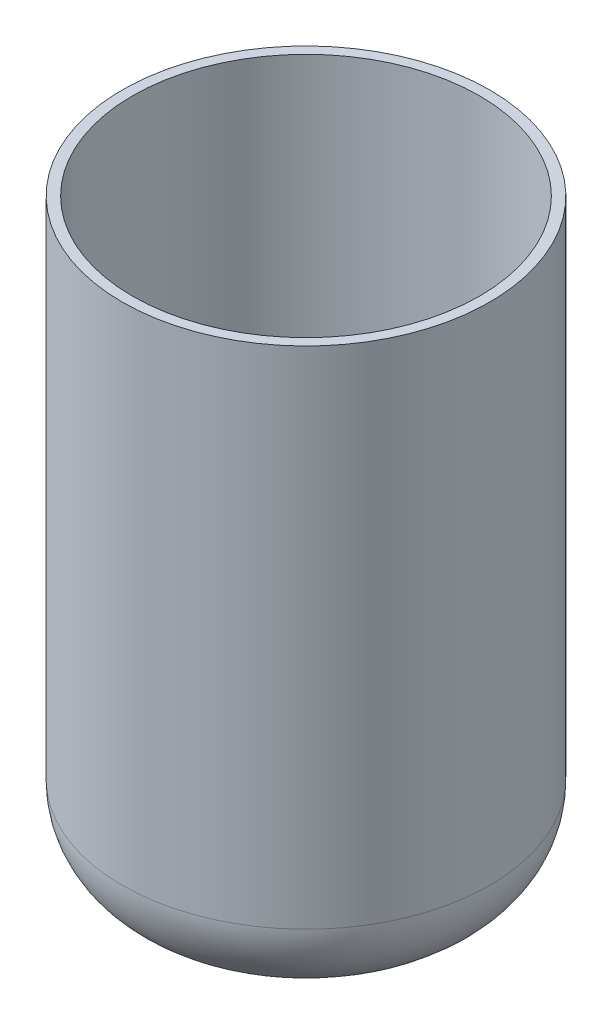
ISO-10303-21;
HEADER;
FILE_DESCRIPTION(('STEP AP214'),'2;1');
FILE_NAME('part.step','',(''),(''),'','','');
FILE_SCHEMA(('AUTOMOTIVE_DESIGN { 1 0 10303 214 1 1 1 1 }'));
ENDSEC;
DATA;
#1=APPLICATION_CONTEXT('core data for automotive mechanical design processes');
#2=APPLICATION_PROTOCOL_DEFINITION('international standard','automotive_design',2000,#1);
#3=PRODUCT_CONTEXT('',#1,'mechanical');
#4=PRODUCT('Part','Part','',(#3));
#5=PRODUCT_RELATED_PRODUCT_CATEGORY('part','',(#4));
#6=PRODUCT_DEFINITION_FORMATION('','',#4);
#7=PRODUCT_DEFINITION_CONTEXT('part definition',#1,'design');
#8=PRODUCT_DEFINITION('design','',#6,#7);
#9=PRODUCT_DEFINITION_SHAPE('','',#8);
#10=(LENGTH_UNIT() NAMED_UNIT(*) SI_UNIT(.MILLI.,.METRE.));
#11=(NAMED_UNIT(*) PLANE_ANGLE_UNIT() SI_UNIT($,.RADIAN.));
#12=(NAMED_UNIT(*) SI_UNIT($,.STERADIAN.) SOLID_ANGLE_UNIT());
#13=UNCERTAINTY_MEASURE_WITH_UNIT(LENGTH_MEASURE(1.E-05),#10,'distance_accuracy_value','');
#14=(GEOMETRIC_REPRESENTATION_CONTEXT(3) GLOBAL_UNCERTAINTY_ASSIGNED_CONTEXT((#13)) GLOBAL_UNIT_ASSIGNED_CONTEXT((#10,
#11,#12)) REPRESENTATION_CONTEXT('',''));
#15=CARTESIAN_POINT('',(0.,0.,0.));
#16=DIRECTION('',(0.,0.,1.));
#17=DIRECTION('',(1.,0.,0.));
#18=AXIS2_PLACEMENT_3D('',#15,#16,#17);
#19=CARTESIAN_POINT('',(0.,0.,0.));
#20=DIRECTION('',(0.,1.,0.));
#21=DIRECTION('',(0.,0.,1.));
#22=AXIS2_PLACEMENT_3D('',#19,#20,#21);
#23=PLANE('',#22);
#24=CARTESIAN_POINT('',(0.,0.,0.));
#25=DIRECTION('',(0.,1.,0.));
#26=DIRECTION('',(-1.,0.,0.));
#27=AXIS2_PLACEMENT_3D('',#24,#25,#26);
#28=CIRCLE('',#27,17.);
#29=CARTESIAN_POINT('',(-17.,0.,0.));
#30=VERTEX_POINT('',#29);
#31=EDGE_CURVE('E59',#30,#30,#28,.T.);
#32=ORIENTED_EDGE('',*,*,#31,.F.);
#33=EDGE_LOOP('',(#32));
#34=FACE_BOUND('',#33,.T.);
#35=CARTESIAN_POINT('',(0.,0.,0.));
#36=DIRECTION('',(0.,1.,0.));
#37=DIRECTION('',(0.,0.,1.));
#38=AXIS2_PLACEMENT_3D('',#35,#36,#37);
#39=CIRCLE('',#38,18.);
#40=CARTESIAN_POINT('',(0.,0.,18.));
#41=VERTEX_POINT('',#40);
#42=EDGE_CURVE('E53',#41,#41,#39,.T.);
#43=ORIENTED_EDGE('',*,*,#42,.T.);
#44=EDGE_LOOP('',(#43));
#45=FACE_BOUND('',#44,.T.);
#46=ADVANCED_FACE('F33',(#34,#45),#23,.T.);
#47=CARTESIAN_POINT('',(0.,0.,0.));
#48=DIRECTION('',(0.,1.,0.));
#49=DIRECTION('',(0.,0.,1.));
#50=AXIS2_PLACEMENT_3D('',#47,#48,#49);
#51=CYLINDRICAL_SURFACE('',#50,17.9999999999999);
#52=CARTESIAN_POINT('',(0.,-49.482627149073,0.));
#53=DIRECTION('',(0.,-1.,0.));
#54=DIRECTION('',(0.,0.,-1.));
#55=AXIS2_PLACEMENT_3D('',#52,#53,#54);
#56=CIRCLE('',#55,17.9999999999999);
#57=CARTESIAN_POINT('',(0.,-49.482627149073,-17.9999999999999));
#58=VERTEX_POINT('',#57);
#59=EDGE_CURVE('E48',#58,#58,#56,.F.);
#60=ORIENTED_EDGE('',*,*,#59,.T.);
#61=EDGE_LOOP('',(#60));
#62=FACE_BOUND('',#61,.T.);
#63=ORIENTED_EDGE('',*,*,#42,.F.);
#64=EDGE_LOOP('',(#63));
#65=FACE_BOUND('',#64,.T.);
#66=ADVANCED_FACE('F94',(#62,#65),#51,.T.);
#67=CARTESIAN_POINT('',(0.,-55.9,0.));
#68=DIRECTION('',(0.,1.,0.));
#69=DIRECTION('',(0.,0.,1.));
#70=AXIS2_PLACEMENT_3D('',#67,#68,#69);
#71=CONICAL_SURFACE('',#70,17.9999999999998,1.35212738092095);
#72=CARTESIAN_POINT('',(0.,-58.812992273091,0.));
#73=DIRECTION('',(0.,1.,0.));
#74=DIRECTION('',(0.,0.,1.));
#75=AXIS2_PLACEMENT_3D('',#72,#73,#74);
#76=CIRCLE('',#75,4.89153477109067);
#77=CARTESIAN_POINT('',(0.,-58.812992273091,4.89153477109067));
#78=VERTEX_POINT('',#77);
#79=EDGE_CURVE('E11',#78,#78,#76,.T.);
#80=ORIENTED_EDGE('',*,*,#79,.T.);
#81=EDGE_LOOP('',(#80));
#82=FACE_BOUND('',#81,.T.);
#83=CARTESIAN_POINT('',(0.,-57.2921236305446,0.));
#84=DIRECTION('',(0.,-1.,0.));
#85=DIRECTION('',(0.,0.,-1.));
#86=AXIS2_PLACEMENT_3D('',#83,#84,#85);
#87=CIRCLE('',#86,11.7354436625492);
#88=CARTESIAN_POINT('',(0.,-57.2921236305446,-11.7354436625492));
#89=VERTEX_POINT('',#88);
#90=EDGE_CURVE('E44',#89,#89,#87,.T.);
#91=ORIENTED_EDGE('',*,*,#90,.T.);
#92=EDGE_LOOP('',(#91));
#93=FACE_BOUND('',#92,.T.);
#94=ADVANCED_FACE('F99',(#82,#93),#71,.T.);
#95=CARTESIAN_POINT('',(0.,-61.,0.));
#96=DIRECTION('',(0.,1.,0.));
#97=DIRECTION('',(0.,0.,1.));
#98=AXIS2_PLACEMENT_3D('',#95,#96,#97);
#99=CYLINDRICAL_SURFACE('',#98,4.5);
#100=CARTESIAN_POINT('',(0.,-59.3010858031829,0.));
#101=DIRECTION('',(0.,-1.,0.));
#102=DIRECTION('',(0.,0.,-1.));
#103=AXIS2_PLACEMENT_3D('',#100,#101,#102);
#104=CIRCLE('',#103,4.5);
#105=CARTESIAN_POINT('',(0.,-59.3010858031829,4.5));
#106=VERTEX_POINT('',#105);
#107=EDGE_CURVE('E40',#106,#106,#104,.T.);
#108=CARTESIAN_POINT('',(0.,-61.,0.));
#109=DIRECTION('',(0.,1.,0.));
#110=DIRECTION('',(0.,0.,1.));
#111=AXIS2_PLACEMENT_3D('',#108,#109,#110);
#112=CIRCLE('',#111,4.5);
#113=CARTESIAN_POINT('',(0.,-61.,4.5));
#114=VERTEX_POINT('',#113);
#115=EDGE_CURVE('E56',#114,#114,#112,.T.);
#116=CARTESIAN_POINT('',(0.,-59.3010858031829,4.5));
#117=CARTESIAN_POINT('',(0.,-59.3187828260664,4.5));
#118=CARTESIAN_POINT('',(0.,-59.33647984895,4.5));
#119=CARTESIAN_POINT('',(0.,-59.371873894717,4.5));
#120=CARTESIAN_POINT('',(0.,-59.3895709176005,4.5));
#121=CARTESIAN_POINT('',(0.,-59.4249649633675,4.5));
#122=CARTESIAN_POINT('',(0.,-59.442661986251,4.5));
#123=CARTESIAN_POINT('',(0.,-59.4780560320181,4.5));
#124=CARTESIAN_POINT('',(0.,-59.4957530549016,4.5));
#125=CARTESIAN_POINT('',(0.,-59.5311471006686,4.5));
#126=CARTESIAN_POINT('',(0.,-59.5488441235521,4.5));
#127=CARTESIAN_POINT('',(0.,-59.5842381693191,4.5));
#128=CARTESIAN_POINT('',(0.,-59.6019351922026,4.5));
#129=CARTESIAN_POINT('',(0.,-59.6373292379696,4.5));
#130=CARTESIAN_POINT('',(0.,-59.6550262608532,4.5));
#131=CARTESIAN_POINT('',(0.,-59.6904203066202,4.5));
#132=CARTESIAN_POINT('',(0.,-59.7081173295037,4.5));
#133=CARTESIAN_POINT('',(0.,-59.7435113752707,4.5));
#134=CARTESIAN_POINT('',(0.,-59.7612083981542,4.5));
#135=CARTESIAN_POINT('',(0.,-59.7966024439213,4.5));
#136=CARTESIAN_POINT('',(0.,-59.8142994668048,4.5));
#137=CARTESIAN_POINT('',(0.,-59.8496935125718,4.5));
#138=CARTESIAN_POINT('',(0.,-59.8673905354553,4.5));
#139=CARTESIAN_POINT('',(0.,-59.9027845812223,4.5));
#140=CARTESIAN_POINT('',(0.,-59.9204816041058,4.5));
#141=CARTESIAN_POINT('',(0.,-59.9558756498729,4.5));
#142=CARTESIAN_POINT('',(0.,-59.9735726727564,4.5));
#143=CARTESIAN_POINT('',(0.,-60.0089667185234,4.5));
#144=CARTESIAN_POINT('',(0.,-60.0266637414069,4.5));
#145=CARTESIAN_POINT('',(0.,-60.0620577871739,4.5));
#146=CARTESIAN_POINT('',(0.,-60.0797548100574,4.5));
#147=CARTESIAN_POINT('',(0.,-60.1151488558244,4.5));
#148=CARTESIAN_POINT('',(0.,-60.132845878708,4.5));
#149=CARTESIAN_POINT('',(0.,-60.168239924475,4.5));
#150=CARTESIAN_POINT('',(0.,-60.1859369473585,4.5));
#151=CARTESIAN_POINT('',(0.,-60.2213309931255,4.5));
#152=CARTESIAN_POINT('',(0.,-60.239028016009,4.5));
#153=CARTESIAN_POINT('',(0.,-60.2744220617761,4.5));
#154=CARTESIAN_POINT('',(0.,-60.2921190846596,4.5));
#155=CARTESIAN_POINT('',(0.,-60.3275131304266,4.5));
#156=CARTESIAN_POINT('',(0.,-60.3452101533101,4.5));
#157=CARTESIAN_POINT('',(0.,-60.3806041990771,4.5));
#158=CARTESIAN_POINT('',(0.,-60.3983012219606,4.5));
#159=CARTESIAN_POINT('',(0.,-60.4336952677276,4.5));
#160=CARTESIAN_POINT('',(0.,-60.4513922906112,4.5));
#161=CARTESIAN_POINT('',(0.,-60.4867863363782,4.5));
#162=CARTESIAN_POINT('',(0.,-60.5044833592617,4.5));
#163=CARTESIAN_POINT('',(0.,-60.5398774050287,4.5));
#164=CARTESIAN_POINT('',(0.,-60.5575744279122,4.5));
#165=CARTESIAN_POINT('',(0.,-60.5929684736792,4.5));
#166=CARTESIAN_POINT('',(0.,-60.6106654965628,4.5));
#167=CARTESIAN_POINT('',(0.,-60.6460595423298,4.5));
#168=CARTESIAN_POINT('',(0.,-60.6637565652133,4.5));
#169=CARTESIAN_POINT('',(0.,-60.6991506109803,4.5));
#170=CARTESIAN_POINT('',(0.,-60.7168476338638,4.5));
#171=CARTESIAN_POINT('',(0.,-60.7522416796308,4.5));
#172=CARTESIAN_POINT('',(0.,-60.7699387025144,4.5));
#173=CARTESIAN_POINT('',(0.,-60.8053327482814,4.5));
#174=CARTESIAN_POINT('',(0.,-60.8230297711649,4.5));
#175=CARTESIAN_POINT('',(0.,-60.8584238169319,4.5));
#176=CARTESIAN_POINT('',(0.,-60.8761208398154,4.5));
#177=CARTESIAN_POINT('',(0.,-60.9115148855824,4.5));
#178=CARTESIAN_POINT('',(0.,-60.929211908466,4.5));
#179=CARTESIAN_POINT('',(0.,-60.964605954233,4.5));
#180=CARTESIAN_POINT('',(0.,-60.9823029771165,4.5));
#181=CARTESIAN_POINT('',(0.,-61.,4.5));
#182=B_SPLINE_CURVE_WITH_KNOTS('',3,(#116,#117,#118,#119,#120,#121,#122,#123,#124,#125,#126,
#127,#128,#129,#130,#131,#132,#133,#134,#135,#136,#137,#138,#139,#140,#141,#142,#143,#144,#145,
#146,#147,#148,#149,#150,#151,#152,#153,#154,#155,#156,#157,#158,#159,#160,#161,#162,#163,#164,
#165,#166,#167,#168,#169,#170,#171,#172,#173,#174,#175,#176,#177,#178,#179,#180,#181),
.UNSPECIFIED.,.F.,.F.,(4,2,2,2,2,2,2,2,2,2,2,2,2,2,2,2,2,2,2,2,2,2,2,2,2,2,2,2,2,2,2,2,4),(0.,
0.0530910686505348,0.10618213730107,0.159273205951604,0.212364274602139,0.265455343252667,
0.318546411903202,0.371637480553737,0.424728549204272,0.477819617854806,0.530910686505334,
0.584001755155869,0.637092823806404,0.690183892456939,0.743274961107466,0.796366029758001,
0.849457098408536,0.902548167059071,0.955639235709606,1.00873030436013,1.06182137301067,
1.1149124416612,1.16800351031174,1.22109457896227,1.2741856476128,1.32727671626334,
1.38036778491387,1.43345885356441,1.48654992221493,1.53964099086547,1.592732059516,
1.64582312816654,1.69891419681707),.UNSPECIFIED.);
#183=EDGE_CURVE('BSEAM105',#106,#114,#182,.T.);
#184=ORIENTED_EDGE('',*,*,#107,.T.);
#185=ORIENTED_EDGE('',*,*,#115,.T.);
#186=ORIENTED_EDGE('',*,*,#183,.T.);
#187=ORIENTED_EDGE('',*,*,#183,.F.);
#188=EDGE_LOOP('',(#184,#186,#185,#187));
#189=FACE_BOUND('',#188,.T.);
#190=ADVANCED_FACE('F105',(#189),#99,.T.);
#191=CARTESIAN_POINT('',(0.,-61.,0.));
#192=DIRECTION('',(0.,1.,0.));
#193=DIRECTION('',(0.,0.,1.));
#194=AXIS2_PLACEMENT_3D('',#191,#192,#193);
#195=PLANE('',#194);
#196=ORIENTED_EDGE('',*,*,#115,.F.);
#197=EDGE_LOOP('',(#196));
#198=FACE_BOUND('',#197,.T.);
#199=ADVANCED_FACE('F110',(#198),#195,.F.);
#200=CARTESIAN_POINT('',(0.,-49.482627149073,0.));
#201=DIRECTION('',(0.,-1.,0.));
#202=DIRECTION('',(0.,0.,-1.));
#203=AXIS2_PLACEMENT_3D('',#200,#201,#202);
#204=TOROIDAL_SURFACE('',#203,9.99999999999989,8.);
#205=ORIENTED_EDGE('',*,*,#90,.F.);
#206=EDGE_LOOP('',(#205));
#207=FACE_BOUND('',#206,.T.);
#208=ORIENTED_EDGE('',*,*,#59,.F.);
#209=EDGE_LOOP('',(#208));
#210=FACE_BOUND('',#209,.T.);
#211=ADVANCED_FACE('F108',(#207,#210),#204,.T.);
#212=CARTESIAN_POINT('',(0.,-59.3010858031829,0.));
#213=DIRECTION('',(0.,-1.,0.));
#214=DIRECTION('',(0.,0.,-1.));
#215=AXIS2_PLACEMENT_3D('',#212,#213,#214);
#216=TOROIDAL_SURFACE('',#215,5.,0.5);
#217=ORIENTED_EDGE('',*,*,#79,.F.);
#218=EDGE_LOOP('',(#217));
#219=FACE_BOUND('',#218,.T.);
#220=ORIENTED_EDGE('',*,*,#107,.F.);
#221=EDGE_LOOP('',(#220));
#222=FACE_BOUND('',#221,.T.);
#223=ADVANCED_FACE('F35',(#219,#222),#216,.F.);
#224=CARTESIAN_POINT('',(0.,0.,0.));
#225=DIRECTION('',(0.,1.,0.));
#226=DIRECTION('',(-1.,0.,0.));
#227=AXIS2_PLACEMENT_3D('',#224,#225,#226);
#228=CYLINDRICAL_SURFACE('',#227,16.9999999999999);
#229=CARTESIAN_POINT('',(0.,-49.482627149073,0.));
#230=DIRECTION('',(0.,1.,0.));
#231=DIRECTION('',(-1.,0.,0.));
#232=AXIS2_PLACEMENT_3D('',#229,#230,#231);
#233=CIRCLE('',#232,16.9999999999998);
#234=CARTESIAN_POINT('',(-16.9999999999998,-49.482627149073,0.));
#235=VERTEX_POINT('',#234);
#236=EDGE_CURVE('E62',#235,#235,#233,.T.);
#237=ORIENTED_EDGE('',*,*,#236,.F.);
#238=EDGE_LOOP('',(#237));
#239=FACE_BOUND('',#238,.T.);
#240=ORIENTED_EDGE('',*,*,#31,.T.);
#241=EDGE_LOOP('',(#240));
#242=FACE_BOUND('',#241,.T.);
#243=ADVANCED_FACE('F83',(#239,#242),#228,.F.);
#244=CARTESIAN_POINT('',(0.,-49.482627149073,0.));
#245=DIRECTION('',(0.,1.,0.));
#246=DIRECTION('',(-1.,0.,0.));
#247=AXIS2_PLACEMENT_3D('',#244,#245,#246);
#248=TOROIDAL_SURFACE('',#247,9.99999999999989,6.99999999999995);
#249=CARTESIAN_POINT('',(0.,-56.3159365703607,0.));
#250=DIRECTION('',(0.,1.,0.));
#251=DIRECTION('',(-1.,0.,0.));
#252=AXIS2_PLACEMENT_3D('',#249,#250,#251);
#253=CIRCLE('',#252,11.5185132047305);
#254=CARTESIAN_POINT('',(-11.5185132047305,-56.3159365703607,0.));
#255=VERTEX_POINT('',#254);
#256=EDGE_CURVE('E65',#255,#255,#253,.T.);
#257=ORIENTED_EDGE('',*,*,#256,.F.);
#258=EDGE_LOOP('',(#257));
#259=FACE_BOUND('',#258,.T.);
#260=ORIENTED_EDGE('',*,*,#236,.T.);
#261=EDGE_LOOP('',(#260));
#262=FACE_BOUND('',#261,.T.);
#263=ADVANCED_FACE('F77',(#259,#262),#248,.F.);
#264=CARTESIAN_POINT('',(0.,-56.3159365703607,0.));
#265=DIRECTION('',(0.,1.,0.));
#266=DIRECTION('',(-1.,0.,0.));
#267=AXIS2_PLACEMENT_3D('',#264,#265,#266);
#268=CONICAL_SURFACE('',#267,11.5185132047305,1.35212738092095);
#269=CARTESIAN_POINT('',(0.,-57.9238129398161,0.));
#270=DIRECTION('',(0.,1.,0.));
#271=DIRECTION('',(-1.,0.,0.));
#272=AXIS2_PLACEMENT_3D('',#269,#270,#271);
#273=CIRCLE('',#272,4.28306954218133);
#274=CARTESIAN_POINT('',(-4.28306954218133,-57.9238129398161,0.));
#275=VERTEX_POINT('',#274);
#276=EDGE_CURVE('E68',#275,#275,#273,.T.);
#277=ORIENTED_EDGE('',*,*,#276,.F.);
#278=EDGE_LOOP('',(#277));
#279=FACE_BOUND('',#278,.T.);
#280=ORIENTED_EDGE('',*,*,#256,.T.);
#281=EDGE_LOOP('',(#280));
#282=FACE_BOUND('',#281,.T.);
#283=ADVANCED_FACE('F74',(#279,#282),#268,.F.);
#284=CARTESIAN_POINT('',(-4.28306954218133,-57.9238129398161,0.));
#285=DIRECTION('',(0.,-1.,0.));
#286=DIRECTION('',(1.,0.,0.));
#287=AXIS2_PLACEMENT_3D('',#284,#285,#286);
#288=PLANE('',#287);
#289=ORIENTED_EDGE('',*,*,#276,.T.);
#290=EDGE_LOOP('',(#289));
#291=FACE_BOUND('',#290,.T.);
#292=ADVANCED_FACE('F72',(#291),#288,.F.);
#293=CLOSED_SHELL('',(#46,#66,#94,#190,#199,#211,#223,#243,#263,#283,#292));
#294=MANIFOLD_SOLID_BREP('B2',#293);
#295=ADVANCED_BREP_SHAPE_REPRESENTATION('',(#18,#294),#14);
#296=SHAPE_DEFINITION_REPRESENTATION(#9,#295);
ENDSEC;
END-ISO-10303-21;
